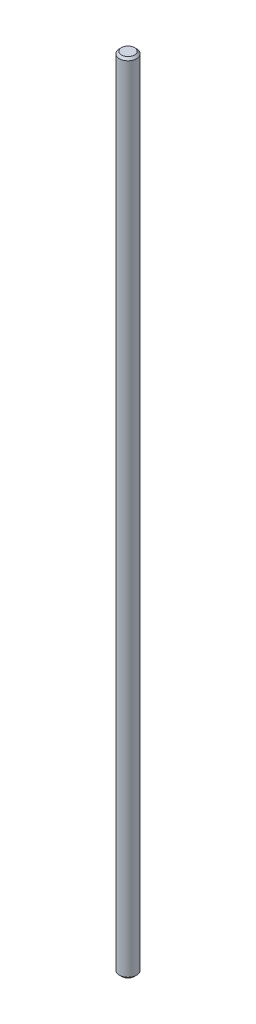
ISO-10303-21;
HEADER;
FILE_DESCRIPTION(('STEP AP214'),'2;1');
FILE_NAME('part.step','',(''),(''),'','','');
FILE_SCHEMA(('AUTOMOTIVE_DESIGN { 1 0 10303 214 1 1 1 1 }'));
ENDSEC;
DATA;
#1=APPLICATION_CONTEXT('core data for automotive mechanical design processes');
#2=APPLICATION_PROTOCOL_DEFINITION('international standard','automotive_design',2000,#1);
#3=PRODUCT_CONTEXT('',#1,'mechanical');
#4=PRODUCT('Part','Part','',(#3));
#5=PRODUCT_RELATED_PRODUCT_CATEGORY('part','',(#4));
#6=PRODUCT_DEFINITION_FORMATION('','',#4);
#7=PRODUCT_DEFINITION_CONTEXT('part definition',#1,'design');
#8=PRODUCT_DEFINITION('design','',#6,#7);
#9=PRODUCT_DEFINITION_SHAPE('','',#8);
#10=(LENGTH_UNIT() NAMED_UNIT(*) SI_UNIT(.MILLI.,.METRE.));
#11=(NAMED_UNIT(*) PLANE_ANGLE_UNIT() SI_UNIT($,.RADIAN.));
#12=(NAMED_UNIT(*) SI_UNIT($,.STERADIAN.) SOLID_ANGLE_UNIT());
#13=UNCERTAINTY_MEASURE_WITH_UNIT(LENGTH_MEASURE(1.E-05),#10,'distance_accuracy_value','');
#14=(GEOMETRIC_REPRESENTATION_CONTEXT(3) GLOBAL_UNCERTAINTY_ASSIGNED_CONTEXT((#13)) GLOBAL_UNIT_ASSIGNED_CONTEXT((#10,
#11,#12)) REPRESENTATION_CONTEXT('',''));
#15=CARTESIAN_POINT('',(0.,0.,0.));
#16=DIRECTION('',(0.,0.,1.));
#17=DIRECTION('',(1.,0.,0.));
#18=AXIS2_PLACEMENT_3D('',#15,#16,#17);
#19=CARTESIAN_POINT('',(0.,370000.,0.));
#20=DIRECTION('',(0.,-1.,0.));
#21=DIRECTION('',(0.,0.,-1.));
#22=AXIS2_PLACEMENT_3D('',#19,#20,#21);
#23=CYLINDRICAL_SURFACE('',#22,4000.);
#24=CARTESIAN_POINT('',(0.,999.999999999943,0.));
#25=DIRECTION('',(0.,1.,0.));
#26=DIRECTION('',(0.,0.,1.));
#27=AXIS2_PLACEMENT_3D('',#24,#25,#26);
#28=CIRCLE('',#27,4000.);
#29=CARTESIAN_POINT('',(0.,999.999999999943,4000.));
#30=VERTEX_POINT('',#29);
#31=EDGE_CURVE('E42',#30,#30,#28,.T.);
#32=ORIENTED_EDGE('',*,*,#31,.T.);
#33=EDGE_LOOP('',(#32));
#34=FACE_BOUND('',#33,.T.);
#35=CARTESIAN_POINT('',(0.,369000.,0.));
#36=DIRECTION('',(0.,1.,0.));
#37=DIRECTION('',(0.,0.,1.));
#38=AXIS2_PLACEMENT_3D('',#35,#36,#37);
#39=CIRCLE('',#38,4000.);
#40=CARTESIAN_POINT('',(0.,369000.,4000.));
#41=VERTEX_POINT('',#40);
#42=EDGE_CURVE('E46',#41,#41,#39,.F.);
#43=ORIENTED_EDGE('',*,*,#42,.T.);
#44=EDGE_LOOP('',(#43));
#45=FACE_BOUND('',#44,.T.);
#46=ADVANCED_FACE('F31',(#34,#45),#23,.T.);
#47=CARTESIAN_POINT('',(0.,370000.,0.));
#48=DIRECTION('',(0.,1.,0.));
#49=DIRECTION('',(0.,0.,1.));
#50=AXIS2_PLACEMENT_3D('',#47,#48,#49);
#51=PLANE('',#50);
#52=CARTESIAN_POINT('',(0.,370000.,0.));
#53=DIRECTION('',(0.,1.,0.));
#54=DIRECTION('',(0.,0.,1.));
#55=AXIS2_PLACEMENT_3D('',#52,#53,#54);
#56=CIRCLE('',#55,3000.00000000006);
#57=CARTESIAN_POINT('',(0.,370000.,3000.00000000006));
#58=VERTEX_POINT('',#57);
#59=EDGE_CURVE('E10',#58,#58,#56,.T.);
#60=ORIENTED_EDGE('',*,*,#59,.T.);
#61=EDGE_LOOP('',(#60));
#62=FACE_BOUND('',#61,.T.);
#63=ADVANCED_FACE('F62',(#62),#51,.T.);
#64=CARTESIAN_POINT('',(0.,0.,0.));
#65=DIRECTION('',(0.,1.,0.));
#66=DIRECTION('',(0.,0.,1.));
#67=AXIS2_PLACEMENT_3D('',#64,#65,#66);
#68=PLANE('',#67);
#69=CARTESIAN_POINT('',(0.,0.,0.));
#70=DIRECTION('',(0.,1.,0.));
#71=DIRECTION('',(0.,0.,1.));
#72=AXIS2_PLACEMENT_3D('',#69,#70,#71);
#73=CIRCLE('',#72,3000.00000000011);
#74=CARTESIAN_POINT('',(0.,0.,3000.00000000011));
#75=VERTEX_POINT('',#74);
#76=EDGE_CURVE('E38',#75,#75,#73,.F.);
#77=ORIENTED_EDGE('',*,*,#76,.T.);
#78=EDGE_LOOP('',(#77));
#79=FACE_BOUND('',#78,.T.);
#80=ADVANCED_FACE('F59',(#79),#68,.F.);
#81=CARTESIAN_POINT('',(0.,999.999999999943,0.));
#82=DIRECTION('',(0.,1.,0.));
#83=DIRECTION('',(0.,0.,1.));
#84=AXIS2_PLACEMENT_3D('',#81,#82,#83);
#85=CONICAL_SURFACE('',#84,4000.,0.78539816339742);
#86=ORIENTED_EDGE('',*,*,#76,.F.);
#87=EDGE_LOOP('',(#86));
#88=FACE_BOUND('',#87,.T.);
#89=ORIENTED_EDGE('',*,*,#31,.F.);
#90=EDGE_LOOP('',(#89));
#91=FACE_BOUND('',#90,.T.);
#92=ADVANCED_FACE('F55',(#88,#91),#85,.T.);
#93=CARTESIAN_POINT('',(0.,370000.,0.));
#94=DIRECTION('',(0.,-1.,0.));
#95=DIRECTION('',(0.,0.,-1.));
#96=AXIS2_PLACEMENT_3D('',#93,#94,#95);
#97=CONICAL_SURFACE('',#96,3000.00000000006,0.78539816339742);
#98=ORIENTED_EDGE('',*,*,#42,.F.);
#99=EDGE_LOOP('',(#98));
#100=FACE_BOUND('',#99,.T.);
#101=ORIENTED_EDGE('',*,*,#59,.F.);
#102=EDGE_LOOP('',(#101));
#103=FACE_BOUND('',#102,.T.);
#104=ADVANCED_FACE('F33',(#100,#103),#97,.T.);
#105=CLOSED_SHELL('',(#46,#63,#80,#92,#104));
#106=MANIFOLD_SOLID_BREP('B2',#105);
#107=ADVANCED_BREP_SHAPE_REPRESENTATION('',(#18,#106),#14);
#108=SHAPE_DEFINITION_REPRESENTATION(#9,#107);
ENDSEC;
END-ISO-10303-21;
